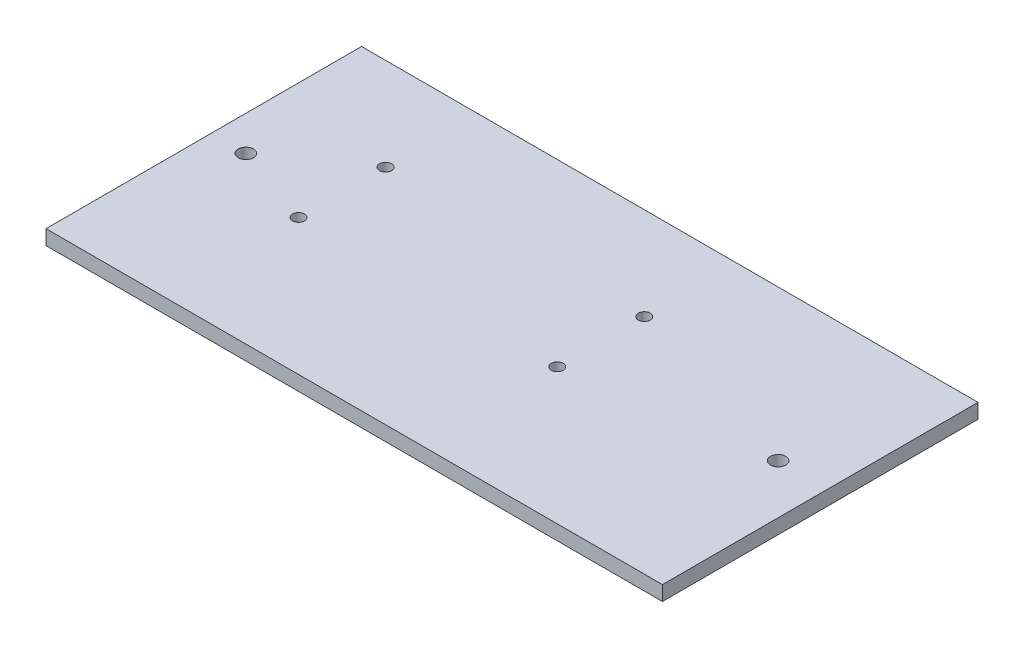
ISO-10303-21;
HEADER;
FILE_DESCRIPTION(('STEP AP214'),'2;1');
FILE_NAME('part.step','',(''),(''),'','','');
FILE_SCHEMA(('AUTOMOTIVE_DESIGN { 1 0 10303 214 1 1 1 1 }'));
ENDSEC;
DATA;
#1=APPLICATION_CONTEXT('core data for automotive mechanical design processes');
#2=APPLICATION_PROTOCOL_DEFINITION('international standard','automotive_design',2000,#1);
#3=PRODUCT_CONTEXT('',#1,'mechanical');
#4=PRODUCT('Part','Part','',(#3));
#5=PRODUCT_RELATED_PRODUCT_CATEGORY('part','',(#4));
#6=PRODUCT_DEFINITION_FORMATION('','',#4);
#7=PRODUCT_DEFINITION_CONTEXT('part definition',#1,'design');
#8=PRODUCT_DEFINITION('design','',#6,#7);
#9=PRODUCT_DEFINITION_SHAPE('','',#8);
#10=(LENGTH_UNIT() NAMED_UNIT(*) SI_UNIT(.MILLI.,.METRE.));
#11=(NAMED_UNIT(*) PLANE_ANGLE_UNIT() SI_UNIT($,.RADIAN.));
#12=(NAMED_UNIT(*) SI_UNIT($,.STERADIAN.) SOLID_ANGLE_UNIT());
#13=UNCERTAINTY_MEASURE_WITH_UNIT(LENGTH_MEASURE(1.E-05),#10,'distance_accuracy_value','');
#14=(GEOMETRIC_REPRESENTATION_CONTEXT(3) GLOBAL_UNCERTAINTY_ASSIGNED_CONTEXT((#13)) GLOBAL_UNIT_ASSIGNED_CONTEXT((#10,
#11,#12)) REPRESENTATION_CONTEXT('',''));
#15=CARTESIAN_POINT('',(0.,0.,0.));
#16=DIRECTION('',(0.,0.,1.));
#17=DIRECTION('',(1.,0.,0.));
#18=AXIS2_PLACEMENT_3D('',#15,#16,#17);
#19=CARTESIAN_POINT('',(0.,3.175,0.));
#20=DIRECTION('',(0.,1.,0.));
#21=DIRECTION('',(0.,0.,1.));
#22=AXIS2_PLACEMENT_3D('',#19,#20,#21);
#23=PLANE('',#22);
#24=CARTESIAN_POINT('',(14.4875,3.175,-14.0875));
#25=DIRECTION('',(0.,1.,0.));
#26=DIRECTION('',(0.,0.,1.));
#27=AXIS2_PLACEMENT_3D('',#24,#25,#26);
#28=CIRCLE('',#27,1.3);
#29=CARTESIAN_POINT('',(14.4875,3.175,-12.7875));
#30=VERTEX_POINT('',#29);
#31=EDGE_CURVE('E134',#30,#30,#28,.T.);
#32=ORIENTED_EDGE('',*,*,#31,.F.);
#33=EDGE_LOOP('',(#32));
#34=FACE_BOUND('',#33,.T.);
#35=CARTESIAN_POINT('',(-41.4125,3.175,-14.0875));
#36=DIRECTION('',(0.,1.,0.));
#37=DIRECTION('',(0.,0.,1.));
#38=AXIS2_PLACEMENT_3D('',#35,#36,#37);
#39=CIRCLE('',#38,1.3);
#40=CARTESIAN_POINT('',(-41.4125,3.175,-12.7875));
#41=VERTEX_POINT('',#40);
#42=EDGE_CURVE('E133',#41,#41,#39,.T.);
#43=ORIENTED_EDGE('',*,*,#42,.F.);
#44=EDGE_LOOP('',(#43));
#45=FACE_BOUND('',#44,.T.);
#46=CARTESIAN_POINT('',(-41.4125,3.175,4.71250000000001));
#47=DIRECTION('',(0.,1.,0.));
#48=DIRECTION('',(0.,0.,1.));
#49=AXIS2_PLACEMENT_3D('',#46,#47,#48);
#50=CIRCLE('',#49,1.3);
#51=CARTESIAN_POINT('',(-41.4125,3.175,6.01250000000001));
#52=VERTEX_POINT('',#51);
#53=EDGE_CURVE('E140',#52,#52,#50,.T.);
#54=ORIENTED_EDGE('',*,*,#53,.F.);
#55=EDGE_LOOP('',(#54));
#56=FACE_BOUND('',#55,.T.);
#57=CARTESIAN_POINT('',(14.4875,3.175,4.7125));
#58=DIRECTION('',(0.,1.,0.));
#59=DIRECTION('',(0.,0.,1.));
#60=AXIS2_PLACEMENT_3D('',#57,#58,#59);
#61=CIRCLE('',#60,1.3);
#62=CARTESIAN_POINT('',(14.4875,3.175,6.0125));
#63=VERTEX_POINT('',#62);
#64=EDGE_CURVE('E126',#63,#63,#61,.T.);
#65=ORIENTED_EDGE('',*,*,#64,.F.);
#66=EDGE_LOOP('',(#65));
#67=FACE_BOUND('',#66,.T.);
#68=CARTESIAN_POINT('',(-59.0875,3.175,-1.5875));
#69=DIRECTION('',(0.,1.,0.));
#70=DIRECTION('',(0.,0.,1.));
#71=AXIS2_PLACEMENT_3D('',#68,#69,#70);
#72=CIRCLE('',#71,1.65);
#73=CARTESIAN_POINT('',(-59.0875,3.175,0.0625000000000024));
#74=VERTEX_POINT('',#73);
#75=EDGE_CURVE('E100',#74,#74,#72,.T.);
#76=ORIENTED_EDGE('',*,*,#75,.F.);
#77=EDGE_LOOP('',(#76));
#78=FACE_BOUND('',#77,.T.);
#79=DIRECTION('',(0.,0.,-1.));
#80=VECTOR('',#79,1.);
#81=CARTESIAN_POINT('',(66.5875,3.175,-34.0875));
#82=LINE('',#81,#80);
#83=CARTESIAN_POINT('',(66.5875,3.175,34.0875));
#84=VERTEX_POINT('',#83);
#85=CARTESIAN_POINT('',(66.5875,3.175,-34.0875));
#86=VERTEX_POINT('',#85);
#87=EDGE_CURVE('E85',#84,#86,#82,.T.);
#88=ORIENTED_EDGE('',*,*,#87,.T.);
#89=DIRECTION('',(-1.,0.,0.));
#90=VECTOR('',#89,1.);
#91=CARTESIAN_POINT('',(-66.5875,3.175,-34.0875));
#92=LINE('',#91,#90);
#93=CARTESIAN_POINT('',(-66.5875,3.175,-34.0875));
#94=VERTEX_POINT('',#93);
#95=EDGE_CURVE('E80',#86,#94,#92,.T.);
#96=ORIENTED_EDGE('',*,*,#95,.T.);
#97=DIRECTION('',(0.,0.,1.));
#98=VECTOR('',#97,1.);
#99=CARTESIAN_POINT('',(-66.5875,3.175,-34.0875));
#100=LINE('',#99,#98);
#101=CARTESIAN_POINT('',(-66.5875,3.175,34.0875));
#102=VERTEX_POINT('',#101);
#103=EDGE_CURVE('E83',#94,#102,#100,.T.);
#104=ORIENTED_EDGE('',*,*,#103,.T.);
#105=DIRECTION('',(1.,0.,0.));
#106=VECTOR('',#105,1.);
#107=CARTESIAN_POINT('',(-66.5875,3.175,34.0875));
#108=LINE('',#107,#106);
#109=EDGE_CURVE('E50',#102,#84,#108,.T.);
#110=ORIENTED_EDGE('',*,*,#109,.T.);
#111=EDGE_LOOP('',(#88,#96,#104,#110));
#112=FACE_BOUND('',#111,.T.);
#113=CARTESIAN_POINT('',(55.9125,3.175,-1.5875));
#114=DIRECTION('',(0.,1.,0.));
#115=DIRECTION('',(0.,0.,1.));
#116=AXIS2_PLACEMENT_3D('',#113,#114,#115);
#117=CIRCLE('',#116,1.65);
#118=CARTESIAN_POINT('',(55.9125,3.175,0.0625000000000024));
#119=VERTEX_POINT('',#118);
#120=EDGE_CURVE('E115',#119,#119,#117,.T.);
#121=ORIENTED_EDGE('',*,*,#120,.F.);
#122=EDGE_LOOP('',(#121));
#123=FACE_BOUND('',#122,.T.);
#124=ADVANCED_FACE('F33',(#34,#45,#56,#67,#78,#112,#123),#23,.T.);
#125=CARTESIAN_POINT('',(0.,0.,0.));
#126=DIRECTION('',(0.,1.,0.));
#127=DIRECTION('',(0.,0.,1.));
#128=AXIS2_PLACEMENT_3D('',#125,#126,#127);
#129=PLANE('',#128);
#130=CARTESIAN_POINT('',(14.4875,0.,-14.0875));
#131=DIRECTION('',(0.,1.,0.));
#132=DIRECTION('',(0.,0.,1.));
#133=AXIS2_PLACEMENT_3D('',#130,#131,#132);
#134=CIRCLE('',#133,1.3);
#135=CARTESIAN_POINT('',(14.4875,0.,-12.7875));
#136=VERTEX_POINT('',#135);
#137=EDGE_CURVE('E130',#136,#136,#134,.F.);
#138=ORIENTED_EDGE('',*,*,#137,.F.);
#139=EDGE_LOOP('',(#138));
#140=FACE_BOUND('',#139,.T.);
#141=CARTESIAN_POINT('',(-41.4125,0.,-14.0875));
#142=DIRECTION('',(0.,1.,0.));
#143=DIRECTION('',(0.,0.,1.));
#144=AXIS2_PLACEMENT_3D('',#141,#142,#143);
#145=CIRCLE('',#144,1.3);
#146=CARTESIAN_POINT('',(-41.4125,0.,-12.7875));
#147=VERTEX_POINT('',#146);
#148=EDGE_CURVE('E137',#147,#147,#145,.F.);
#149=ORIENTED_EDGE('',*,*,#148,.F.);
#150=EDGE_LOOP('',(#149));
#151=FACE_BOUND('',#150,.T.);
#152=CARTESIAN_POINT('',(-41.4125,0.,4.71250000000001));
#153=DIRECTION('',(0.,1.,0.));
#154=DIRECTION('',(0.,0.,1.));
#155=AXIS2_PLACEMENT_3D('',#152,#153,#154);
#156=CIRCLE('',#155,1.3);
#157=CARTESIAN_POINT('',(-41.4125,0.,6.01250000000001));
#158=VERTEX_POINT('',#157);
#159=EDGE_CURVE('E129',#158,#158,#156,.F.);
#160=ORIENTED_EDGE('',*,*,#159,.F.);
#161=EDGE_LOOP('',(#160));
#162=FACE_BOUND('',#161,.T.);
#163=CARTESIAN_POINT('',(14.4875,0.,4.7125));
#164=DIRECTION('',(0.,1.,0.));
#165=DIRECTION('',(0.,0.,1.));
#166=AXIS2_PLACEMENT_3D('',#163,#164,#165);
#167=CIRCLE('',#166,1.3);
#168=CARTESIAN_POINT('',(14.4875,0.,6.0125));
#169=VERTEX_POINT('',#168);
#170=EDGE_CURVE('E121',#169,#169,#167,.F.);
#171=ORIENTED_EDGE('',*,*,#170,.F.);
#172=EDGE_LOOP('',(#171));
#173=FACE_BOUND('',#172,.T.);
#174=DIRECTION('',(0.,0.,-1.));
#175=VECTOR('',#174,1.);
#176=CARTESIAN_POINT('',(66.5875,0.,-34.0875));
#177=LINE('',#176,#175);
#178=CARTESIAN_POINT('',(66.5875,0.,34.0875));
#179=VERTEX_POINT('',#178);
#180=CARTESIAN_POINT('',(66.5875,0.,-34.0875));
#181=VERTEX_POINT('',#180);
#182=EDGE_CURVE('E97',#179,#181,#177,.T.);
#183=ORIENTED_EDGE('',*,*,#182,.F.);
#184=DIRECTION('',(1.,0.,0.));
#185=VECTOR('',#184,1.);
#186=CARTESIAN_POINT('',(-66.5875,0.,34.0875));
#187=LINE('',#186,#185);
#188=CARTESIAN_POINT('',(-66.5875,0.,34.0875));
#189=VERTEX_POINT('',#188);
#190=EDGE_CURVE('E73',#189,#179,#187,.T.);
#191=ORIENTED_EDGE('',*,*,#190,.F.);
#192=DIRECTION('',(0.,0.,1.));
#193=VECTOR('',#192,1.);
#194=CARTESIAN_POINT('',(-66.5875,0.,-34.0875));
#195=LINE('',#194,#193);
#196=CARTESIAN_POINT('',(-66.5875,0.,-34.0875));
#197=VERTEX_POINT('',#196);
#198=EDGE_CURVE('E67',#197,#189,#195,.T.);
#199=ORIENTED_EDGE('',*,*,#198,.F.);
#200=DIRECTION('',(-1.,0.,0.));
#201=VECTOR('',#200,1.);
#202=CARTESIAN_POINT('',(-66.5875,0.,-34.0875));
#203=LINE('',#202,#201);
#204=EDGE_CURVE('E89',#181,#197,#203,.T.);
#205=ORIENTED_EDGE('',*,*,#204,.F.);
#206=EDGE_LOOP('',(#183,#191,#199,#205));
#207=FACE_BOUND('',#206,.T.);
#208=CARTESIAN_POINT('',(-59.0875,0.,-1.5875));
#209=DIRECTION('',(0.,1.,0.));
#210=DIRECTION('',(0.,0.,1.));
#211=AXIS2_PLACEMENT_3D('',#208,#209,#210);
#212=CIRCLE('',#211,1.65);
#213=CARTESIAN_POINT('',(-59.0875,0.,0.0625000000000024));
#214=VERTEX_POINT('',#213);
#215=EDGE_CURVE('E112',#214,#214,#212,.T.);
#216=ORIENTED_EDGE('',*,*,#215,.T.);
#217=EDGE_LOOP('',(#216));
#218=FACE_BOUND('',#217,.T.);
#219=CARTESIAN_POINT('',(55.9125,0.,-1.5875));
#220=DIRECTION('',(0.,1.,0.));
#221=DIRECTION('',(0.,0.,1.));
#222=AXIS2_PLACEMENT_3D('',#219,#220,#221);
#223=CIRCLE('',#222,1.65);
#224=CARTESIAN_POINT('',(55.9125,0.,0.0625000000000024));
#225=VERTEX_POINT('',#224);
#226=EDGE_CURVE('E118',#225,#225,#223,.T.);
#227=ORIENTED_EDGE('',*,*,#226,.T.);
#228=EDGE_LOOP('',(#227));
#229=FACE_BOUND('',#228,.T.);
#230=ADVANCED_FACE('F108',(#140,#151,#162,#173,#207,#218,#229),#129,.F.);
#231=CARTESIAN_POINT('',(66.5875,3.175,-34.0875));
#232=DIRECTION('',(-1.,0.,0.));
#233=DIRECTION('',(0.,0.,1.));
#234=AXIS2_PLACEMENT_3D('',#231,#232,#233);
#235=PLANE('',#234);
#236=ORIENTED_EDGE('',*,*,#182,.T.);
#237=DIRECTION('',(0.,-1.,0.));
#238=VECTOR('',#237,1.);
#239=CARTESIAN_POINT('',(66.5875,3.175,-34.0875));
#240=LINE('',#239,#238);
#241=EDGE_CURVE('E11',#86,#181,#240,.T.);
#242=ORIENTED_EDGE('',*,*,#241,.F.);
#243=ORIENTED_EDGE('',*,*,#87,.F.);
#244=DIRECTION('',(0.,-1.,0.));
#245=VECTOR('',#244,1.);
#246=CARTESIAN_POINT('',(66.5875,3.175,34.0875));
#247=LINE('',#246,#245);
#248=EDGE_CURVE('E93',#84,#179,#247,.T.);
#249=ORIENTED_EDGE('',*,*,#248,.T.);
#250=EDGE_LOOP('',(#236,#242,#243,#249));
#251=FACE_BOUND('',#250,.T.);
#252=ADVANCED_FACE('F35',(#251),#235,.F.);
#253=CARTESIAN_POINT('',(-66.5875,3.175,-34.0875));
#254=DIRECTION('',(0.,0.,1.));
#255=DIRECTION('',(1.,0.,0.));
#256=AXIS2_PLACEMENT_3D('',#253,#254,#255);
#257=PLANE('',#256);
#258=ORIENTED_EDGE('',*,*,#204,.T.);
#259=DIRECTION('',(0.,-1.,0.));
#260=VECTOR('',#259,1.);
#261=CARTESIAN_POINT('',(-66.5875,3.175,-34.0875));
#262=LINE('',#261,#260);
#263=EDGE_CURVE('E42',#94,#197,#262,.T.);
#264=ORIENTED_EDGE('',*,*,#263,.F.);
#265=ORIENTED_EDGE('',*,*,#95,.F.);
#266=ORIENTED_EDGE('',*,*,#241,.T.);
#267=EDGE_LOOP('',(#258,#264,#265,#266));
#268=FACE_BOUND('',#267,.T.);
#269=ADVANCED_FACE('F88',(#268),#257,.F.);
#270=CARTESIAN_POINT('',(-66.5875,3.175,-34.0875));
#271=DIRECTION('',(1.,0.,0.));
#272=DIRECTION('',(0.,0.,-1.));
#273=AXIS2_PLACEMENT_3D('',#270,#271,#272);
#274=PLANE('',#273);
#275=ORIENTED_EDGE('',*,*,#198,.T.);
#276=DIRECTION('',(0.,-1.,0.));
#277=VECTOR('',#276,1.);
#278=CARTESIAN_POINT('',(-66.5875,3.175,34.0875));
#279=LINE('',#278,#277);
#280=EDGE_CURVE('E90',#102,#189,#279,.T.);
#281=ORIENTED_EDGE('',*,*,#280,.F.);
#282=ORIENTED_EDGE('',*,*,#103,.F.);
#283=ORIENTED_EDGE('',*,*,#263,.T.);
#284=EDGE_LOOP('',(#275,#281,#282,#283));
#285=FACE_BOUND('',#284,.T.);
#286=ADVANCED_FACE('F91',(#285),#274,.F.);
#287=CARTESIAN_POINT('',(-66.5875,3.175,34.0875));
#288=DIRECTION('',(0.,0.,-1.));
#289=DIRECTION('',(-1.,0.,0.));
#290=AXIS2_PLACEMENT_3D('',#287,#288,#289);
#291=PLANE('',#290);
#292=ORIENTED_EDGE('',*,*,#190,.T.);
#293=ORIENTED_EDGE('',*,*,#248,.F.);
#294=ORIENTED_EDGE('',*,*,#109,.F.);
#295=ORIENTED_EDGE('',*,*,#280,.T.);
#296=EDGE_LOOP('',(#292,#293,#294,#295));
#297=FACE_BOUND('',#296,.T.);
#298=ADVANCED_FACE('F105',(#297),#291,.F.);
#299=CARTESIAN_POINT('',(-59.0875,3.175,-1.5875));
#300=DIRECTION('',(0.,-1.,0.));
#301=DIRECTION('',(0.,0.,-1.));
#302=AXIS2_PLACEMENT_3D('',#299,#300,#301);
#303=CYLINDRICAL_SURFACE('',#302,1.65);
#304=ORIENTED_EDGE('',*,*,#75,.T.);
#305=EDGE_LOOP('',(#304));
#306=FACE_BOUND('',#305,.T.);
#307=ORIENTED_EDGE('',*,*,#215,.F.);
#308=EDGE_LOOP('',(#307));
#309=FACE_BOUND('',#308,.T.);
#310=ADVANCED_FACE('F158',(#306,#309),#303,.F.);
#311=CARTESIAN_POINT('',(55.9125,3.175,-1.5875));
#312=DIRECTION('',(0.,-1.,0.));
#313=DIRECTION('',(0.,0.,-1.));
#314=AXIS2_PLACEMENT_3D('',#311,#312,#313);
#315=CYLINDRICAL_SURFACE('',#314,1.65);
#316=ORIENTED_EDGE('',*,*,#120,.T.);
#317=EDGE_LOOP('',(#316));
#318=FACE_BOUND('',#317,.T.);
#319=ORIENTED_EDGE('',*,*,#226,.F.);
#320=EDGE_LOOP('',(#319));
#321=FACE_BOUND('',#320,.T.);
#322=ADVANCED_FACE('F161',(#318,#321),#315,.F.);
#323=CARTESIAN_POINT('',(14.4875,-3.67695526217005,4.7125));
#324=DIRECTION('',(0.,1.,0.));
#325=DIRECTION('',(0.,0.,1.));
#326=AXIS2_PLACEMENT_3D('',#323,#324,#325);
#327=CYLINDRICAL_SURFACE('',#326,1.3);
#328=CARTESIAN_POINT('',(14.4875,0.,6.0125));
#329=CARTESIAN_POINT('',(14.4875,0.0330729166666662,6.0125));
#330=CARTESIAN_POINT('',(14.4875,0.0661458333333328,6.0125));
#331=CARTESIAN_POINT('',(14.4875,0.132291666666666,6.0125));
#332=CARTESIAN_POINT('',(14.4875,0.165364583333333,6.0125));
#333=CARTESIAN_POINT('',(14.4875,0.231510416666666,6.0125));
#334=CARTESIAN_POINT('',(14.4875,0.264583333333333,6.0125));
#335=CARTESIAN_POINT('',(14.4875,0.330729166666666,6.0125));
#336=CARTESIAN_POINT('',(14.4875,0.363802083333332,6.0125));
#337=CARTESIAN_POINT('',(14.4875,0.429947916666666,6.0125));
#338=CARTESIAN_POINT('',(14.4875,0.463020833333332,6.0125));
#339=CARTESIAN_POINT('',(14.4875,0.529166666666666,6.0125));
#340=CARTESIAN_POINT('',(14.4875,0.562239583333333,6.0125));
#341=CARTESIAN_POINT('',(14.4875,0.628385416666666,6.0125));
#342=CARTESIAN_POINT('',(14.4875,0.661458333333332,6.0125));
#343=CARTESIAN_POINT('',(14.4875,0.727604166666666,6.0125));
#344=CARTESIAN_POINT('',(14.4875,0.760677083333333,6.0125));
#345=CARTESIAN_POINT('',(14.4875,0.826822916666666,6.0125));
#346=CARTESIAN_POINT('',(14.4875,0.859895833333333,6.0125));
#347=CARTESIAN_POINT('',(14.4875,0.926041666666666,6.0125));
#348=CARTESIAN_POINT('',(14.4875,0.959114583333333,6.0125));
#349=CARTESIAN_POINT('',(14.4875,1.02526041666667,6.0125));
#350=CARTESIAN_POINT('',(14.4875,1.05833333333333,6.0125));
#351=CARTESIAN_POINT('',(14.4875,1.12447916666667,6.0125));
#352=CARTESIAN_POINT('',(14.4875,1.15755208333333,6.0125));
#353=CARTESIAN_POINT('',(14.4875,1.22369791666667,6.0125));
#354=CARTESIAN_POINT('',(14.4875,1.25677083333333,6.0125));
#355=CARTESIAN_POINT('',(14.4875,1.32291666666667,6.0125));
#356=CARTESIAN_POINT('',(14.4875,1.35598958333333,6.0125));
#357=CARTESIAN_POINT('',(14.4875,1.42213541666667,6.0125));
#358=CARTESIAN_POINT('',(14.4875,1.45520833333333,6.0125));
#359=CARTESIAN_POINT('',(14.4875,1.52135416666667,6.0125));
#360=CARTESIAN_POINT('',(14.4875,1.55442708333333,6.0125));
#361=CARTESIAN_POINT('',(14.4875,1.62057291666667,6.0125));
#362=CARTESIAN_POINT('',(14.4875,1.65364583333333,6.0125));
#363=CARTESIAN_POINT('',(14.4875,1.71979166666667,6.0125));
#364=CARTESIAN_POINT('',(14.4875,1.75286458333333,6.0125));
#365=CARTESIAN_POINT('',(14.4875,1.81901041666667,6.0125));
#366=CARTESIAN_POINT('',(14.4875,1.85208333333333,6.0125));
#367=CARTESIAN_POINT('',(14.4875,1.91822916666667,6.0125));
#368=CARTESIAN_POINT('',(14.4875,1.95130208333333,6.0125));
#369=CARTESIAN_POINT('',(14.4875,2.01744791666667,6.0125));
#370=CARTESIAN_POINT('',(14.4875,2.05052083333333,6.0125));
#371=CARTESIAN_POINT('',(14.4875,2.11666666666667,6.0125));
#372=CARTESIAN_POINT('',(14.4875,2.14973958333333,6.0125));
#373=CARTESIAN_POINT('',(14.4875,2.21588541666667,6.0125));
#374=CARTESIAN_POINT('',(14.4875,2.24895833333333,6.0125));
#375=CARTESIAN_POINT('',(14.4875,2.31510416666667,6.0125));
#376=CARTESIAN_POINT('',(14.4875,2.34817708333333,6.0125));
#377=CARTESIAN_POINT('',(14.4875,2.41432291666667,6.0125));
#378=CARTESIAN_POINT('',(14.4875,2.44739583333333,6.0125));
#379=CARTESIAN_POINT('',(14.4875,2.51354166666667,6.0125));
#380=CARTESIAN_POINT('',(14.4875,2.54661458333333,6.0125));
#381=CARTESIAN_POINT('',(14.4875,2.61276041666667,6.0125));
#382=CARTESIAN_POINT('',(14.4875,2.64583333333333,6.0125));
#383=CARTESIAN_POINT('',(14.4875,2.71197916666667,6.0125));
#384=CARTESIAN_POINT('',(14.4875,2.74505208333333,6.0125));
#385=CARTESIAN_POINT('',(14.4875,2.81119791666667,6.0125));
#386=CARTESIAN_POINT('',(14.4875,2.84427083333333,6.0125));
#387=CARTESIAN_POINT('',(14.4875,2.91041666666667,6.0125));
#388=CARTESIAN_POINT('',(14.4875,2.94348958333333,6.0125));
#389=CARTESIAN_POINT('',(14.4875,3.00963541666667,6.0125));
#390=CARTESIAN_POINT('',(14.4875,3.04270833333333,6.0125));
#391=CARTESIAN_POINT('',(14.4875,3.10885416666667,6.0125));
#392=CARTESIAN_POINT('',(14.4875,3.14192708333333,6.0125));
#393=CARTESIAN_POINT('',(14.4875,3.175,6.0125));
#394=B_SPLINE_CURVE_WITH_KNOTS('',3,(#328,#329,#330,#331,#332,#333,#334,#335,#336,#337,#338,
#339,#340,#341,#342,#343,#344,#345,#346,#347,#348,#349,#350,#351,#352,#353,#354,#355,#356,#357,
#358,#359,#360,#361,#362,#363,#364,#365,#366,#367,#368,#369,#370,#371,#372,#373,#374,#375,#376,
#377,#378,#379,#380,#381,#382,#383,#384,#385,#386,#387,#388,#389,#390,#391,#392,#393),
.UNSPECIFIED.,.F.,.F.,(4,2,2,2,2,2,2,2,2,2,2,2,2,2,2,2,2,2,2,2,2,2,2,2,2,2,2,2,2,2,2,2,4),(0.,
0.0992187499999999,0.1984375,0.29765625,0.396874999999999,0.49609375,0.5953125,
0.694531249999999,0.79375,0.89296875,0.9921875,1.09140625,1.190625,1.28984375,1.3890625,
1.48828125,1.5875,1.68671875,1.7859375,1.88515625,1.984375,2.08359375,2.1828125,2.28203125,
2.38125,2.48046875,2.5796875,2.67890625,2.778125,2.87734375,2.9765625,3.07578125,3.175),.UNSPECIFIED.);
#395=EDGE_CURVE('BSEAM171',#169,#63,#394,.T.);
#396=ORIENTED_EDGE('',*,*,#170,.T.);
#397=ORIENTED_EDGE('',*,*,#64,.T.);
#398=ORIENTED_EDGE('',*,*,#395,.T.);
#399=ORIENTED_EDGE('',*,*,#395,.F.);
#400=EDGE_LOOP('',(#396,#398,#397,#399));
#401=FACE_BOUND('',#400,.T.);
#402=ADVANCED_FACE('F171',(#401),#327,.F.);
#403=CARTESIAN_POINT('',(-41.4125,-3.67695526217005,4.71250000000001));
#404=DIRECTION('',(0.,1.,0.));
#405=DIRECTION('',(0.,0.,1.));
#406=AXIS2_PLACEMENT_3D('',#403,#404,#405);
#407=CYLINDRICAL_SURFACE('',#406,1.3);
#408=CARTESIAN_POINT('',(-41.4125,0.,6.01250000000001));
#409=CARTESIAN_POINT('',(-41.4125,0.0330729166666662,6.01250000000001));
#410=CARTESIAN_POINT('',(-41.4125,0.0661458333333328,6.01250000000001));
#411=CARTESIAN_POINT('',(-41.4125,0.132291666666666,6.01250000000001));
#412=CARTESIAN_POINT('',(-41.4125,0.165364583333333,6.01250000000001));
#413=CARTESIAN_POINT('',(-41.4125,0.231510416666666,6.01250000000001));
#414=CARTESIAN_POINT('',(-41.4125,0.264583333333333,6.01250000000001));
#415=CARTESIAN_POINT('',(-41.4125,0.330729166666666,6.01250000000001));
#416=CARTESIAN_POINT('',(-41.4125,0.363802083333332,6.01250000000001));
#417=CARTESIAN_POINT('',(-41.4125,0.429947916666666,6.01250000000001));
#418=CARTESIAN_POINT('',(-41.4125,0.463020833333332,6.01250000000001));
#419=CARTESIAN_POINT('',(-41.4125,0.529166666666666,6.01250000000001));
#420=CARTESIAN_POINT('',(-41.4125,0.562239583333333,6.01250000000001));
#421=CARTESIAN_POINT('',(-41.4125,0.628385416666666,6.01250000000001));
#422=CARTESIAN_POINT('',(-41.4125,0.661458333333332,6.01250000000001));
#423=CARTESIAN_POINT('',(-41.4125,0.727604166666666,6.01250000000001));
#424=CARTESIAN_POINT('',(-41.4125,0.760677083333333,6.01250000000001));
#425=CARTESIAN_POINT('',(-41.4125,0.826822916666666,6.01250000000001));
#426=CARTESIAN_POINT('',(-41.4125,0.859895833333333,6.01250000000001));
#427=CARTESIAN_POINT('',(-41.4125,0.926041666666666,6.01250000000001));
#428=CARTESIAN_POINT('',(-41.4125,0.959114583333333,6.01250000000001));
#429=CARTESIAN_POINT('',(-41.4125,1.02526041666667,6.01250000000001));
#430=CARTESIAN_POINT('',(-41.4125,1.05833333333333,6.01250000000001));
#431=CARTESIAN_POINT('',(-41.4125,1.12447916666667,6.01250000000001));
#432=CARTESIAN_POINT('',(-41.4125,1.15755208333333,6.01250000000001));
#433=CARTESIAN_POINT('',(-41.4125,1.22369791666667,6.01250000000001));
#434=CARTESIAN_POINT('',(-41.4125,1.25677083333333,6.01250000000001));
#435=CARTESIAN_POINT('',(-41.4125,1.32291666666667,6.01250000000001));
#436=CARTESIAN_POINT('',(-41.4125,1.35598958333333,6.01250000000001));
#437=CARTESIAN_POINT('',(-41.4125,1.42213541666667,6.01250000000001));
#438=CARTESIAN_POINT('',(-41.4125,1.45520833333333,6.01250000000001));
#439=CARTESIAN_POINT('',(-41.4125,1.52135416666667,6.01250000000001));
#440=CARTESIAN_POINT('',(-41.4125,1.55442708333333,6.01250000000001));
#441=CARTESIAN_POINT('',(-41.4125,1.62057291666667,6.01250000000001));
#442=CARTESIAN_POINT('',(-41.4125,1.65364583333333,6.01250000000001));
#443=CARTESIAN_POINT('',(-41.4125,1.71979166666667,6.01250000000001));
#444=CARTESIAN_POINT('',(-41.4125,1.75286458333333,6.01250000000001));
#445=CARTESIAN_POINT('',(-41.4125,1.81901041666667,6.01250000000001));
#446=CARTESIAN_POINT('',(-41.4125,1.85208333333333,6.01250000000001));
#447=CARTESIAN_POINT('',(-41.4125,1.91822916666667,6.01250000000001));
#448=CARTESIAN_POINT('',(-41.4125,1.95130208333333,6.01250000000001));
#449=CARTESIAN_POINT('',(-41.4125,2.01744791666667,6.01250000000001));
#450=CARTESIAN_POINT('',(-41.4125,2.05052083333333,6.01250000000001));
#451=CARTESIAN_POINT('',(-41.4125,2.11666666666667,6.01250000000001));
#452=CARTESIAN_POINT('',(-41.4125,2.14973958333333,6.01250000000001));
#453=CARTESIAN_POINT('',(-41.4125,2.21588541666667,6.01250000000001));
#454=CARTESIAN_POINT('',(-41.4125,2.24895833333333,6.01250000000001));
#455=CARTESIAN_POINT('',(-41.4125,2.31510416666667,6.01250000000001));
#456=CARTESIAN_POINT('',(-41.4125,2.34817708333333,6.01250000000001));
#457=CARTESIAN_POINT('',(-41.4125,2.41432291666667,6.01250000000001));
#458=CARTESIAN_POINT('',(-41.4125,2.44739583333333,6.01250000000001));
#459=CARTESIAN_POINT('',(-41.4125,2.51354166666667,6.01250000000001));
#460=CARTESIAN_POINT('',(-41.4125,2.54661458333333,6.01250000000001));
#461=CARTESIAN_POINT('',(-41.4125,2.61276041666667,6.01250000000001));
#462=CARTESIAN_POINT('',(-41.4125,2.64583333333333,6.01250000000001));
#463=CARTESIAN_POINT('',(-41.4125,2.71197916666667,6.01250000000001));
#464=CARTESIAN_POINT('',(-41.4125,2.74505208333333,6.01250000000001));
#465=CARTESIAN_POINT('',(-41.4125,2.81119791666667,6.01250000000001));
#466=CARTESIAN_POINT('',(-41.4125,2.84427083333333,6.01250000000001));
#467=CARTESIAN_POINT('',(-41.4125,2.91041666666667,6.01250000000001));
#468=CARTESIAN_POINT('',(-41.4125,2.94348958333333,6.01250000000001));
#469=CARTESIAN_POINT('',(-41.4125,3.00963541666667,6.01250000000001));
#470=CARTESIAN_POINT('',(-41.4125,3.04270833333333,6.01250000000001));
#471=CARTESIAN_POINT('',(-41.4125,3.10885416666667,6.01250000000001));
#472=CARTESIAN_POINT('',(-41.4125,3.14192708333333,6.01250000000001));
#473=CARTESIAN_POINT('',(-41.4125,3.175,6.01250000000001));
#474=B_SPLINE_CURVE_WITH_KNOTS('',3,(#408,#409,#410,#411,#412,#413,#414,#415,#416,#417,#418,
#419,#420,#421,#422,#423,#424,#425,#426,#427,#428,#429,#430,#431,#432,#433,#434,#435,#436,#437,
#438,#439,#440,#441,#442,#443,#444,#445,#446,#447,#448,#449,#450,#451,#452,#453,#454,#455,#456,
#457,#458,#459,#460,#461,#462,#463,#464,#465,#466,#467,#468,#469,#470,#471,#472,#473),
.UNSPECIFIED.,.F.,.F.,(4,2,2,2,2,2,2,2,2,2,2,2,2,2,2,2,2,2,2,2,2,2,2,2,2,2,2,2,2,2,2,2,4),(0.,
0.0992187499999999,0.1984375,0.29765625,0.396874999999999,0.49609375,0.5953125,
0.694531249999999,0.79375,0.89296875,0.9921875,1.09140625,1.190625,1.28984375,1.3890625,
1.48828125,1.5875,1.68671875,1.7859375,1.88515625,1.984375,2.08359375,2.1828125,2.28203125,
2.38125,2.48046875,2.5796875,2.67890625,2.778125,2.87734375,2.9765625,3.07578125,3.175),.UNSPECIFIED.);
#475=EDGE_CURVE('BSEAM148',#158,#52,#474,.T.);
#476=ORIENTED_EDGE('',*,*,#159,.T.);
#477=ORIENTED_EDGE('',*,*,#53,.T.);
#478=ORIENTED_EDGE('',*,*,#475,.T.);
#479=ORIENTED_EDGE('',*,*,#475,.F.);
#480=EDGE_LOOP('',(#476,#478,#477,#479));
#481=FACE_BOUND('',#480,.T.);
#482=ADVANCED_FACE('F148',(#481),#407,.F.);
#483=CARTESIAN_POINT('',(-41.4125,-3.67695526217005,-14.0875));
#484=DIRECTION('',(0.,1.,0.));
#485=DIRECTION('',(0.,0.,1.));
#486=AXIS2_PLACEMENT_3D('',#483,#484,#485);
#487=CYLINDRICAL_SURFACE('',#486,1.3);
#488=CARTESIAN_POINT('',(-41.4125,0.,-12.7875));
#489=CARTESIAN_POINT('',(-41.4125,0.0330729166666662,-12.7875));
#490=CARTESIAN_POINT('',(-41.4125,0.0661458333333328,-12.7875));
#491=CARTESIAN_POINT('',(-41.4125,0.132291666666666,-12.7875));
#492=CARTESIAN_POINT('',(-41.4125,0.165364583333333,-12.7875));
#493=CARTESIAN_POINT('',(-41.4125,0.231510416666666,-12.7875));
#494=CARTESIAN_POINT('',(-41.4125,0.264583333333333,-12.7875));
#495=CARTESIAN_POINT('',(-41.4125,0.330729166666666,-12.7875));
#496=CARTESIAN_POINT('',(-41.4125,0.363802083333332,-12.7875));
#497=CARTESIAN_POINT('',(-41.4125,0.429947916666666,-12.7875));
#498=CARTESIAN_POINT('',(-41.4125,0.463020833333332,-12.7875));
#499=CARTESIAN_POINT('',(-41.4125,0.529166666666666,-12.7875));
#500=CARTESIAN_POINT('',(-41.4125,0.562239583333333,-12.7875));
#501=CARTESIAN_POINT('',(-41.4125,0.628385416666666,-12.7875));
#502=CARTESIAN_POINT('',(-41.4125,0.661458333333332,-12.7875));
#503=CARTESIAN_POINT('',(-41.4125,0.727604166666666,-12.7875));
#504=CARTESIAN_POINT('',(-41.4125,0.760677083333333,-12.7875));
#505=CARTESIAN_POINT('',(-41.4125,0.826822916666666,-12.7875));
#506=CARTESIAN_POINT('',(-41.4125,0.859895833333333,-12.7875));
#507=CARTESIAN_POINT('',(-41.4125,0.926041666666666,-12.7875));
#508=CARTESIAN_POINT('',(-41.4125,0.959114583333333,-12.7875));
#509=CARTESIAN_POINT('',(-41.4125,1.02526041666667,-12.7875));
#510=CARTESIAN_POINT('',(-41.4125,1.05833333333333,-12.7875));
#511=CARTESIAN_POINT('',(-41.4125,1.12447916666667,-12.7875));
#512=CARTESIAN_POINT('',(-41.4125,1.15755208333333,-12.7875));
#513=CARTESIAN_POINT('',(-41.4125,1.22369791666667,-12.7875));
#514=CARTESIAN_POINT('',(-41.4125,1.25677083333333,-12.7875));
#515=CARTESIAN_POINT('',(-41.4125,1.32291666666667,-12.7875));
#516=CARTESIAN_POINT('',(-41.4125,1.35598958333333,-12.7875));
#517=CARTESIAN_POINT('',(-41.4125,1.42213541666667,-12.7875));
#518=CARTESIAN_POINT('',(-41.4125,1.45520833333333,-12.7875));
#519=CARTESIAN_POINT('',(-41.4125,1.52135416666667,-12.7875));
#520=CARTESIAN_POINT('',(-41.4125,1.55442708333333,-12.7875));
#521=CARTESIAN_POINT('',(-41.4125,1.62057291666667,-12.7875));
#522=CARTESIAN_POINT('',(-41.4125,1.65364583333333,-12.7875));
#523=CARTESIAN_POINT('',(-41.4125,1.71979166666667,-12.7875));
#524=CARTESIAN_POINT('',(-41.4125,1.75286458333333,-12.7875));
#525=CARTESIAN_POINT('',(-41.4125,1.81901041666667,-12.7875));
#526=CARTESIAN_POINT('',(-41.4125,1.85208333333333,-12.7875));
#527=CARTESIAN_POINT('',(-41.4125,1.91822916666667,-12.7875));
#528=CARTESIAN_POINT('',(-41.4125,1.95130208333333,-12.7875));
#529=CARTESIAN_POINT('',(-41.4125,2.01744791666667,-12.7875));
#530=CARTESIAN_POINT('',(-41.4125,2.05052083333333,-12.7875));
#531=CARTESIAN_POINT('',(-41.4125,2.11666666666667,-12.7875));
#532=CARTESIAN_POINT('',(-41.4125,2.14973958333333,-12.7875));
#533=CARTESIAN_POINT('',(-41.4125,2.21588541666667,-12.7875));
#534=CARTESIAN_POINT('',(-41.4125,2.24895833333333,-12.7875));
#535=CARTESIAN_POINT('',(-41.4125,2.31510416666667,-12.7875));
#536=CARTESIAN_POINT('',(-41.4125,2.34817708333333,-12.7875));
#537=CARTESIAN_POINT('',(-41.4125,2.41432291666667,-12.7875));
#538=CARTESIAN_POINT('',(-41.4125,2.44739583333333,-12.7875));
#539=CARTESIAN_POINT('',(-41.4125,2.51354166666667,-12.7875));
#540=CARTESIAN_POINT('',(-41.4125,2.54661458333333,-12.7875));
#541=CARTESIAN_POINT('',(-41.4125,2.61276041666667,-12.7875));
#542=CARTESIAN_POINT('',(-41.4125,2.64583333333333,-12.7875));
#543=CARTESIAN_POINT('',(-41.4125,2.71197916666667,-12.7875));
#544=CARTESIAN_POINT('',(-41.4125,2.74505208333333,-12.7875));
#545=CARTESIAN_POINT('',(-41.4125,2.81119791666667,-12.7875));
#546=CARTESIAN_POINT('',(-41.4125,2.84427083333333,-12.7875));
#547=CARTESIAN_POINT('',(-41.4125,2.91041666666667,-12.7875));
#548=CARTESIAN_POINT('',(-41.4125,2.94348958333333,-12.7875));
#549=CARTESIAN_POINT('',(-41.4125,3.00963541666667,-12.7875));
#550=CARTESIAN_POINT('',(-41.4125,3.04270833333333,-12.7875));
#551=CARTESIAN_POINT('',(-41.4125,3.10885416666667,-12.7875));
#552=CARTESIAN_POINT('',(-41.4125,3.14192708333333,-12.7875));
#553=CARTESIAN_POINT('',(-41.4125,3.175,-12.7875));
#554=B_SPLINE_CURVE_WITH_KNOTS('',3,(#488,#489,#490,#491,#492,#493,#494,#495,#496,#497,#498,
#499,#500,#501,#502,#503,#504,#505,#506,#507,#508,#509,#510,#511,#512,#513,#514,#515,#516,#517,
#518,#519,#520,#521,#522,#523,#524,#525,#526,#527,#528,#529,#530,#531,#532,#533,#534,#535,#536,
#537,#538,#539,#540,#541,#542,#543,#544,#545,#546,#547,#548,#549,#550,#551,#552,#553),
.UNSPECIFIED.,.F.,.F.,(4,2,2,2,2,2,2,2,2,2,2,2,2,2,2,2,2,2,2,2,2,2,2,2,2,2,2,2,2,2,2,2,4),(0.,
0.0992187499999999,0.1984375,0.29765625,0.396874999999999,0.49609375,0.5953125,
0.694531249999999,0.79375,0.89296875,0.9921875,1.09140625,1.190625,1.28984375,1.3890625,
1.48828125,1.5875,1.68671875,1.7859375,1.88515625,1.984375,2.08359375,2.1828125,2.28203125,
2.38125,2.48046875,2.5796875,2.67890625,2.778125,2.87734375,2.9765625,3.07578125,3.175),.UNSPECIFIED.);
#555=EDGE_CURVE('BSEAM243',#147,#41,#554,.T.);
#556=ORIENTED_EDGE('',*,*,#148,.T.);
#557=ORIENTED_EDGE('',*,*,#42,.T.);
#558=ORIENTED_EDGE('',*,*,#555,.T.);
#559=ORIENTED_EDGE('',*,*,#555,.F.);
#560=EDGE_LOOP('',(#556,#558,#557,#559));
#561=FACE_BOUND('',#560,.T.);
#562=ADVANCED_FACE('F243',(#561),#487,.F.);
#563=CARTESIAN_POINT('',(14.4875,-3.67695526217005,-14.0875));
#564=DIRECTION('',(0.,1.,0.));
#565=DIRECTION('',(0.,0.,1.));
#566=AXIS2_PLACEMENT_3D('',#563,#564,#565);
#567=CYLINDRICAL_SURFACE('',#566,1.3);
#568=CARTESIAN_POINT('',(14.4875,0.,-12.7875));
#569=CARTESIAN_POINT('',(14.4875,0.0330729166666662,-12.7875));
#570=CARTESIAN_POINT('',(14.4875,0.0661458333333328,-12.7875));
#571=CARTESIAN_POINT('',(14.4875,0.132291666666666,-12.7875));
#572=CARTESIAN_POINT('',(14.4875,0.165364583333333,-12.7875));
#573=CARTESIAN_POINT('',(14.4875,0.231510416666666,-12.7875));
#574=CARTESIAN_POINT('',(14.4875,0.264583333333333,-12.7875));
#575=CARTESIAN_POINT('',(14.4875,0.330729166666666,-12.7875));
#576=CARTESIAN_POINT('',(14.4875,0.363802083333332,-12.7875));
#577=CARTESIAN_POINT('',(14.4875,0.429947916666666,-12.7875));
#578=CARTESIAN_POINT('',(14.4875,0.463020833333332,-12.7875));
#579=CARTESIAN_POINT('',(14.4875,0.529166666666666,-12.7875));
#580=CARTESIAN_POINT('',(14.4875,0.562239583333333,-12.7875));
#581=CARTESIAN_POINT('',(14.4875,0.628385416666666,-12.7875));
#582=CARTESIAN_POINT('',(14.4875,0.661458333333332,-12.7875));
#583=CARTESIAN_POINT('',(14.4875,0.727604166666666,-12.7875));
#584=CARTESIAN_POINT('',(14.4875,0.760677083333333,-12.7875));
#585=CARTESIAN_POINT('',(14.4875,0.826822916666666,-12.7875));
#586=CARTESIAN_POINT('',(14.4875,0.859895833333333,-12.7875));
#587=CARTESIAN_POINT('',(14.4875,0.926041666666666,-12.7875));
#588=CARTESIAN_POINT('',(14.4875,0.959114583333333,-12.7875));
#589=CARTESIAN_POINT('',(14.4875,1.02526041666667,-12.7875));
#590=CARTESIAN_POINT('',(14.4875,1.05833333333333,-12.7875));
#591=CARTESIAN_POINT('',(14.4875,1.12447916666667,-12.7875));
#592=CARTESIAN_POINT('',(14.4875,1.15755208333333,-12.7875));
#593=CARTESIAN_POINT('',(14.4875,1.22369791666667,-12.7875));
#594=CARTESIAN_POINT('',(14.4875,1.25677083333333,-12.7875));
#595=CARTESIAN_POINT('',(14.4875,1.32291666666667,-12.7875));
#596=CARTESIAN_POINT('',(14.4875,1.35598958333333,-12.7875));
#597=CARTESIAN_POINT('',(14.4875,1.42213541666667,-12.7875));
#598=CARTESIAN_POINT('',(14.4875,1.45520833333333,-12.7875));
#599=CARTESIAN_POINT('',(14.4875,1.52135416666667,-12.7875));
#600=CARTESIAN_POINT('',(14.4875,1.55442708333333,-12.7875));
#601=CARTESIAN_POINT('',(14.4875,1.62057291666667,-12.7875));
#602=CARTESIAN_POINT('',(14.4875,1.65364583333333,-12.7875));
#603=CARTESIAN_POINT('',(14.4875,1.71979166666667,-12.7875));
#604=CARTESIAN_POINT('',(14.4875,1.75286458333333,-12.7875));
#605=CARTESIAN_POINT('',(14.4875,1.81901041666667,-12.7875));
#606=CARTESIAN_POINT('',(14.4875,1.85208333333333,-12.7875));
#607=CARTESIAN_POINT('',(14.4875,1.91822916666667,-12.7875));
#608=CARTESIAN_POINT('',(14.4875,1.95130208333333,-12.7875));
#609=CARTESIAN_POINT('',(14.4875,2.01744791666667,-12.7875));
#610=CARTESIAN_POINT('',(14.4875,2.05052083333333,-12.7875));
#611=CARTESIAN_POINT('',(14.4875,2.11666666666667,-12.7875));
#612=CARTESIAN_POINT('',(14.4875,2.14973958333333,-12.7875));
#613=CARTESIAN_POINT('',(14.4875,2.21588541666667,-12.7875));
#614=CARTESIAN_POINT('',(14.4875,2.24895833333333,-12.7875));
#615=CARTESIAN_POINT('',(14.4875,2.31510416666667,-12.7875));
#616=CARTESIAN_POINT('',(14.4875,2.34817708333333,-12.7875));
#617=CARTESIAN_POINT('',(14.4875,2.41432291666667,-12.7875));
#618=CARTESIAN_POINT('',(14.4875,2.44739583333333,-12.7875));
#619=CARTESIAN_POINT('',(14.4875,2.51354166666667,-12.7875));
#620=CARTESIAN_POINT('',(14.4875,2.54661458333333,-12.7875));
#621=CARTESIAN_POINT('',(14.4875,2.61276041666667,-12.7875));
#622=CARTESIAN_POINT('',(14.4875,2.64583333333333,-12.7875));
#623=CARTESIAN_POINT('',(14.4875,2.71197916666667,-12.7875));
#624=CARTESIAN_POINT('',(14.4875,2.74505208333333,-12.7875));
#625=CARTESIAN_POINT('',(14.4875,2.81119791666667,-12.7875));
#626=CARTESIAN_POINT('',(14.4875,2.84427083333333,-12.7875));
#627=CARTESIAN_POINT('',(14.4875,2.91041666666667,-12.7875));
#628=CARTESIAN_POINT('',(14.4875,2.94348958333333,-12.7875));
#629=CARTESIAN_POINT('',(14.4875,3.00963541666667,-12.7875));
#630=CARTESIAN_POINT('',(14.4875,3.04270833333333,-12.7875));
#631=CARTESIAN_POINT('',(14.4875,3.10885416666667,-12.7875));
#632=CARTESIAN_POINT('',(14.4875,3.14192708333333,-12.7875));
#633=CARTESIAN_POINT('',(14.4875,3.175,-12.7875));
#634=B_SPLINE_CURVE_WITH_KNOTS('',3,(#568,#569,#570,#571,#572,#573,#574,#575,#576,#577,#578,
#579,#580,#581,#582,#583,#584,#585,#586,#587,#588,#589,#590,#591,#592,#593,#594,#595,#596,#597,
#598,#599,#600,#601,#602,#603,#604,#605,#606,#607,#608,#609,#610,#611,#612,#613,#614,#615,#616,
#617,#618,#619,#620,#621,#622,#623,#624,#625,#626,#627,#628,#629,#630,#631,#632,#633),
.UNSPECIFIED.,.F.,.F.,(4,2,2,2,2,2,2,2,2,2,2,2,2,2,2,2,2,2,2,2,2,2,2,2,2,2,2,2,2,2,2,2,4),(0.,
0.0992187499999999,0.1984375,0.29765625,0.396874999999999,0.49609375,0.5953125,
0.694531249999999,0.79375,0.89296875,0.9921875,1.09140625,1.190625,1.28984375,1.3890625,
1.48828125,1.5875,1.68671875,1.7859375,1.88515625,1.984375,2.08359375,2.1828125,2.28203125,
2.38125,2.48046875,2.5796875,2.67890625,2.778125,2.87734375,2.9765625,3.07578125,3.175),.UNSPECIFIED.);
#635=EDGE_CURVE('BSEAM252',#136,#30,#634,.T.);
#636=ORIENTED_EDGE('',*,*,#137,.T.);
#637=ORIENTED_EDGE('',*,*,#31,.T.);
#638=ORIENTED_EDGE('',*,*,#635,.T.);
#639=ORIENTED_EDGE('',*,*,#635,.F.);
#640=EDGE_LOOP('',(#636,#638,#637,#639));
#641=FACE_BOUND('',#640,.T.);
#642=ADVANCED_FACE('F252',(#641),#567,.F.);
#643=CLOSED_SHELL('',(#124,#230,#252,#269,#286,#298,#310,#322,#402,#482,#562,#642));
#644=MANIFOLD_SOLID_BREP('B2',#643);
#645=ADVANCED_BREP_SHAPE_REPRESENTATION('',(#18,#644),#14);
#646=SHAPE_DEFINITION_REPRESENTATION(#9,#645);
ENDSEC;
END-ISO-10303-21;
